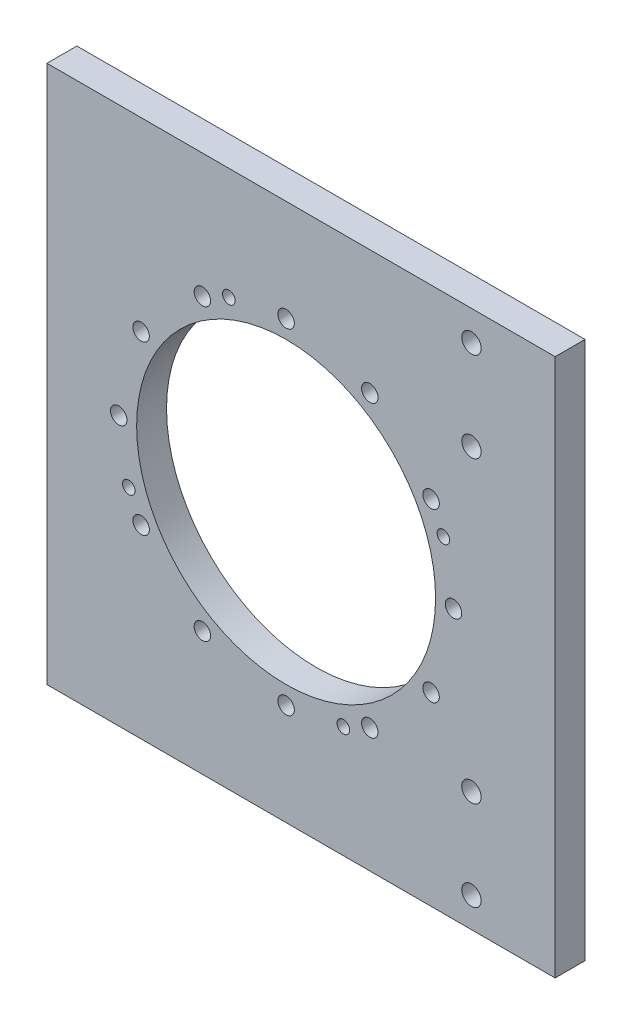
ISO-10303-21;
HEADER;
FILE_DESCRIPTION(('STEP AP214'),'2;1');
FILE_NAME('part.step','',(''),(''),'','','');
FILE_SCHEMA(('AUTOMOTIVE_DESIGN { 1 0 10303 214 1 1 1 1 }'));
ENDSEC;
DATA;
#1=APPLICATION_CONTEXT('core data for automotive mechanical design processes');
#2=APPLICATION_PROTOCOL_DEFINITION('international standard','automotive_design',2000,#1);
#3=PRODUCT_CONTEXT('',#1,'mechanical');
#4=PRODUCT('Part','Part','',(#3));
#5=PRODUCT_RELATED_PRODUCT_CATEGORY('part','',(#4));
#6=PRODUCT_DEFINITION_FORMATION('','',#4);
#7=PRODUCT_DEFINITION_CONTEXT('part definition',#1,'design');
#8=PRODUCT_DEFINITION('design','',#6,#7);
#9=PRODUCT_DEFINITION_SHAPE('','',#8);
#10=(LENGTH_UNIT() NAMED_UNIT(*) SI_UNIT(.MILLI.,.METRE.));
#11=(NAMED_UNIT(*) PLANE_ANGLE_UNIT() SI_UNIT($,.RADIAN.));
#12=(NAMED_UNIT(*) SI_UNIT($,.STERADIAN.) SOLID_ANGLE_UNIT());
#13=UNCERTAINTY_MEASURE_WITH_UNIT(LENGTH_MEASURE(1.E-05),#10,'distance_accuracy_value','');
#14=(GEOMETRIC_REPRESENTATION_CONTEXT(3) GLOBAL_UNCERTAINTY_ASSIGNED_CONTEXT((#13)) GLOBAL_UNIT_ASSIGNED_CONTEXT((#10,
#11,#12)) REPRESENTATION_CONTEXT('',''));
#15=CARTESIAN_POINT('',(0.,0.,0.));
#16=DIRECTION('',(0.,0.,1.));
#17=DIRECTION('',(1.,0.,0.));
#18=AXIS2_PLACEMENT_3D('',#15,#16,#17);
#19=CARTESIAN_POINT('',(-80.,90.,10.));
#20=DIRECTION('',(1.,0.,0.));
#21=DIRECTION('',(0.,0.,-1.));
#22=AXIS2_PLACEMENT_3D('',#19,#20,#21);
#23=PLANE('',#22);
#24=DIRECTION('',(0.,-1.,0.));
#25=VECTOR('',#24,1.);
#26=CARTESIAN_POINT('',(-80.,90.,0.));
#27=LINE('',#26,#25);
#28=CARTESIAN_POINT('',(-80.,90.,0.));
#29=VERTEX_POINT('',#28);
#30=CARTESIAN_POINT('',(-80.,-90.,0.));
#31=VERTEX_POINT('',#30);
#32=EDGE_CURVE('E115',#29,#31,#27,.T.);
#33=ORIENTED_EDGE('',*,*,#32,.T.);
#34=DIRECTION('',(0.,0.,-1.));
#35=VECTOR('',#34,1.);
#36=CARTESIAN_POINT('',(-80.,-90.,10.));
#37=LINE('',#36,#35);
#38=CARTESIAN_POINT('',(-80.,-90.,10.));
#39=VERTEX_POINT('',#38);
#40=EDGE_CURVE('E11',#39,#31,#37,.T.);
#41=ORIENTED_EDGE('',*,*,#40,.F.);
#42=DIRECTION('',(0.,-1.,0.));
#43=VECTOR('',#42,1.);
#44=CARTESIAN_POINT('',(-80.,90.,10.));
#45=LINE('',#44,#43);
#46=CARTESIAN_POINT('',(-80.,90.,10.));
#47=VERTEX_POINT('',#46);
#48=EDGE_CURVE('E99',#47,#39,#45,.T.);
#49=ORIENTED_EDGE('',*,*,#48,.F.);
#50=DIRECTION('',(0.,0.,-1.));
#51=VECTOR('',#50,1.);
#52=CARTESIAN_POINT('',(-80.,90.,10.));
#53=LINE('',#52,#51);
#54=EDGE_CURVE('E111',#47,#29,#53,.T.);
#55=ORIENTED_EDGE('',*,*,#54,.T.);
#56=EDGE_LOOP('',(#33,#41,#49,#55));
#57=FACE_BOUND('',#56,.T.);
#58=ADVANCED_FACE('F47',(#57),#23,.F.);
#59=CARTESIAN_POINT('',(-80.,-90.,10.));
#60=DIRECTION('',(0.,1.,0.));
#61=DIRECTION('',(0.,0.,1.));
#62=AXIS2_PLACEMENT_3D('',#59,#60,#61);
#63=PLANE('',#62);
#64=DIRECTION('',(1.,0.,0.));
#65=VECTOR('',#64,1.);
#66=CARTESIAN_POINT('',(-80.,-90.,0.));
#67=LINE('',#66,#65);
#68=CARTESIAN_POINT('',(90.,-90.,0.));
#69=VERTEX_POINT('',#68);
#70=EDGE_CURVE('E104',#31,#69,#67,.T.);
#71=ORIENTED_EDGE('',*,*,#70,.T.);
#72=DIRECTION('',(0.,0.,-1.));
#73=VECTOR('',#72,1.);
#74=CARTESIAN_POINT('',(90.,-90.,10.));
#75=LINE('',#74,#73);
#76=CARTESIAN_POINT('',(90.,-90.,10.));
#77=VERTEX_POINT('',#76);
#78=EDGE_CURVE('E56',#77,#69,#75,.T.);
#79=ORIENTED_EDGE('',*,*,#78,.F.);
#80=DIRECTION('',(1.,0.,0.));
#81=VECTOR('',#80,1.);
#82=CARTESIAN_POINT('',(-80.,-90.,10.));
#83=LINE('',#82,#81);
#84=EDGE_CURVE('E94',#39,#77,#83,.T.);
#85=ORIENTED_EDGE('',*,*,#84,.F.);
#86=ORIENTED_EDGE('',*,*,#40,.T.);
#87=EDGE_LOOP('',(#71,#79,#85,#86));
#88=FACE_BOUND('',#87,.T.);
#89=ADVANCED_FACE('F103',(#88),#63,.F.);
#90=CARTESIAN_POINT('',(90.,-90.,10.));
#91=DIRECTION('',(-1.,0.,0.));
#92=DIRECTION('',(0.,0.,1.));
#93=AXIS2_PLACEMENT_3D('',#90,#91,#92);
#94=PLANE('',#93);
#95=DIRECTION('',(0.,1.,0.));
#96=VECTOR('',#95,1.);
#97=CARTESIAN_POINT('',(90.,-90.,0.));
#98=LINE('',#97,#96);
#99=CARTESIAN_POINT('',(90.,90.,0.));
#100=VERTEX_POINT('',#99);
#101=EDGE_CURVE('E81',#69,#100,#98,.T.);
#102=ORIENTED_EDGE('',*,*,#101,.T.);
#103=DIRECTION('',(0.,0.,-1.));
#104=VECTOR('',#103,1.);
#105=CARTESIAN_POINT('',(90.,90.,10.));
#106=LINE('',#105,#104);
#107=CARTESIAN_POINT('',(90.,90.,10.));
#108=VERTEX_POINT('',#107);
#109=EDGE_CURVE('E106',#108,#100,#106,.T.);
#110=ORIENTED_EDGE('',*,*,#109,.F.);
#111=DIRECTION('',(0.,1.,0.));
#112=VECTOR('',#111,1.);
#113=CARTESIAN_POINT('',(90.,-90.,10.));
#114=LINE('',#113,#112);
#115=EDGE_CURVE('E97',#77,#108,#114,.T.);
#116=ORIENTED_EDGE('',*,*,#115,.F.);
#117=ORIENTED_EDGE('',*,*,#78,.T.);
#118=EDGE_LOOP('',(#102,#110,#116,#117));
#119=FACE_BOUND('',#118,.T.);
#120=ADVANCED_FACE('F107',(#119),#94,.F.);
#121=CARTESIAN_POINT('',(90.,90.,10.));
#122=DIRECTION('',(0.,-1.,0.));
#123=DIRECTION('',(0.,0.,-1.));
#124=AXIS2_PLACEMENT_3D('',#121,#122,#123);
#125=PLANE('',#124);
#126=DIRECTION('',(-1.,0.,0.));
#127=VECTOR('',#126,1.);
#128=CARTESIAN_POINT('',(90.,90.,0.));
#129=LINE('',#128,#127);
#130=EDGE_CURVE('E87',#100,#29,#129,.T.);
#131=ORIENTED_EDGE('',*,*,#130,.T.);
#132=ORIENTED_EDGE('',*,*,#54,.F.);
#133=DIRECTION('',(-1.,0.,0.));
#134=VECTOR('',#133,1.);
#135=CARTESIAN_POINT('',(90.,90.,10.));
#136=LINE('',#135,#134);
#137=EDGE_CURVE('E64',#108,#47,#136,.T.);
#138=ORIENTED_EDGE('',*,*,#137,.F.);
#139=ORIENTED_EDGE('',*,*,#109,.T.);
#140=EDGE_LOOP('',(#131,#132,#138,#139));
#141=FACE_BOUND('',#140,.T.);
#142=ADVANCED_FACE('F129',(#141),#125,.F.);
#143=CARTESIAN_POINT('',(0.,0.,10.));
#144=DIRECTION('',(0.,0.,1.));
#145=DIRECTION('',(1.,0.,0.));
#146=AXIS2_PLACEMENT_3D('',#143,#144,#145);
#147=PLANE('',#146);
#148=CARTESIAN_POINT('',(-28.,-48.4974226119286,10.));
#149=DIRECTION('',(0.,0.,1.));
#150=DIRECTION('',(1.,0.,0.));
#151=AXIS2_PLACEMENT_3D('',#148,#149,#150);
#152=CIRCLE('',#151,2.75);
#153=CARTESIAN_POINT('',(-25.25,-48.4974226119286,10.));
#154=VERTEX_POINT('',#153);
#155=EDGE_CURVE('E119',#154,#154,#152,.T.);
#156=ORIENTED_EDGE('',*,*,#155,.F.);
#157=EDGE_LOOP('',(#156));
#158=FACE_BOUND('',#157,.T.);
#159=CARTESIAN_POINT('',(0.,-56.,10.));
#160=DIRECTION('',(0.,0.,1.));
#161=DIRECTION('',(1.,0.,0.));
#162=AXIS2_PLACEMENT_3D('',#159,#160,#161);
#163=CIRCLE('',#162,2.75);
#164=CARTESIAN_POINT('',(2.74999999999999,-56.,10.));
#165=VERTEX_POINT('',#164);
#166=EDGE_CURVE('E139',#165,#165,#163,.T.);
#167=ORIENTED_EDGE('',*,*,#166,.F.);
#168=EDGE_LOOP('',(#167));
#169=FACE_BOUND('',#168,.T.);
#170=CARTESIAN_POINT('',(28.,-48.4974226119286,10.));
#171=DIRECTION('',(0.,0.,1.));
#172=DIRECTION('',(1.,0.,0.));
#173=AXIS2_PLACEMENT_3D('',#170,#171,#172);
#174=CIRCLE('',#173,2.75);
#175=CARTESIAN_POINT('',(30.75,-48.4974226119286,10.));
#176=VERTEX_POINT('',#175);
#177=EDGE_CURVE('E143',#176,#176,#174,.T.);
#178=ORIENTED_EDGE('',*,*,#177,.F.);
#179=EDGE_LOOP('',(#178));
#180=FACE_BOUND('',#179,.T.);
#181=CARTESIAN_POINT('',(48.4974226119285,-28.,10.));
#182=DIRECTION('',(0.,0.,1.));
#183=DIRECTION('',(1.,0.,0.));
#184=AXIS2_PLACEMENT_3D('',#181,#182,#183);
#185=CIRCLE('',#184,2.75);
#186=CARTESIAN_POINT('',(51.2474226119285,-28.,10.));
#187=VERTEX_POINT('',#186);
#188=EDGE_CURVE('E147',#187,#187,#185,.T.);
#189=ORIENTED_EDGE('',*,*,#188,.F.);
#190=EDGE_LOOP('',(#189));
#191=FACE_BOUND('',#190,.T.);
#192=CARTESIAN_POINT('',(52.6227867640109,19.1531280262374,10.));
#193=DIRECTION('',(0.,0.,1.));
#194=DIRECTION('',(1.,0.,0.));
#195=AXIS2_PLACEMENT_3D('',#192,#193,#194);
#196=CIRCLE('',#195,2.1);
#197=CARTESIAN_POINT('',(54.7227867640109,19.1531280262374,10.));
#198=VERTEX_POINT('',#197);
#199=EDGE_CURVE('E151',#198,#198,#196,.T.);
#200=ORIENTED_EDGE('',*,*,#199,.F.);
#201=EDGE_LOOP('',(#200));
#202=FACE_BOUND('',#201,.T.);
#203=CARTESIAN_POINT('',(-19.1531280262374,52.6227867640109,10.));
#204=DIRECTION('',(0.,0.,1.));
#205=DIRECTION('',(1.,0.,0.));
#206=AXIS2_PLACEMENT_3D('',#203,#204,#205);
#207=CIRCLE('',#206,2.1);
#208=CARTESIAN_POINT('',(-17.0531280262374,52.6227867640109,10.));
#209=VERTEX_POINT('',#208);
#210=EDGE_CURVE('E155',#209,#209,#207,.T.);
#211=ORIENTED_EDGE('',*,*,#210,.F.);
#212=EDGE_LOOP('',(#211));
#213=FACE_BOUND('',#212,.T.);
#214=CARTESIAN_POINT('',(-52.6227867640109,-19.1531280262374,10.));
#215=DIRECTION('',(0.,0.,1.));
#216=DIRECTION('',(1.,0.,0.));
#217=AXIS2_PLACEMENT_3D('',#214,#215,#216);
#218=CIRCLE('',#217,2.1);
#219=CARTESIAN_POINT('',(-50.5227867640109,-19.1531280262374,10.));
#220=VERTEX_POINT('',#219);
#221=EDGE_CURVE('E159',#220,#220,#218,.T.);
#222=ORIENTED_EDGE('',*,*,#221,.F.);
#223=EDGE_LOOP('',(#222));
#224=FACE_BOUND('',#223,.T.);
#225=CARTESIAN_POINT('',(19.1531280262375,-52.6227867640109,10.));
#226=DIRECTION('',(0.,0.,1.));
#227=DIRECTION('',(1.,0.,0.));
#228=AXIS2_PLACEMENT_3D('',#225,#226,#227);
#229=CIRCLE('',#228,2.1);
#230=CARTESIAN_POINT('',(21.2531280262375,-52.6227867640109,10.));
#231=VERTEX_POINT('',#230);
#232=EDGE_CURVE('E163',#231,#231,#229,.T.);
#233=ORIENTED_EDGE('',*,*,#232,.F.);
#234=EDGE_LOOP('',(#233));
#235=FACE_BOUND('',#234,.T.);
#236=CARTESIAN_POINT('',(-48.4974226119286,-28.,10.));
#237=DIRECTION('',(0.,0.,1.));
#238=DIRECTION('',(1.,0.,0.));
#239=AXIS2_PLACEMENT_3D('',#236,#237,#238);
#240=CIRCLE('',#239,2.75);
#241=CARTESIAN_POINT('',(-45.7474226119286,-28.,10.));
#242=VERTEX_POINT('',#241);
#243=EDGE_CURVE('E167',#242,#242,#240,.T.);
#244=ORIENTED_EDGE('',*,*,#243,.F.);
#245=EDGE_LOOP('',(#244));
#246=FACE_BOUND('',#245,.T.);
#247=CARTESIAN_POINT('',(-56.,0.,10.));
#248=DIRECTION('',(0.,0.,1.));
#249=DIRECTION('',(1.,0.,0.));
#250=AXIS2_PLACEMENT_3D('',#247,#248,#249);
#251=CIRCLE('',#250,2.75);
#252=CARTESIAN_POINT('',(-53.25,0.,10.));
#253=VERTEX_POINT('',#252);
#254=EDGE_CURVE('E171',#253,#253,#251,.T.);
#255=ORIENTED_EDGE('',*,*,#254,.F.);
#256=EDGE_LOOP('',(#255));
#257=FACE_BOUND('',#256,.T.);
#258=CARTESIAN_POINT('',(-48.4974226119286,28.,10.));
#259=DIRECTION('',(0.,0.,1.));
#260=DIRECTION('',(1.,0.,0.));
#261=AXIS2_PLACEMENT_3D('',#258,#259,#260);
#262=CIRCLE('',#261,2.75);
#263=CARTESIAN_POINT('',(-45.7474226119286,28.,10.));
#264=VERTEX_POINT('',#263);
#265=EDGE_CURVE('E175',#264,#264,#262,.T.);
#266=ORIENTED_EDGE('',*,*,#265,.F.);
#267=EDGE_LOOP('',(#266));
#268=FACE_BOUND('',#267,.T.);
#269=CARTESIAN_POINT('',(-28.,48.4974226119286,10.));
#270=DIRECTION('',(0.,0.,1.));
#271=DIRECTION('',(1.,0.,0.));
#272=AXIS2_PLACEMENT_3D('',#269,#270,#271);
#273=CIRCLE('',#272,2.75);
#274=CARTESIAN_POINT('',(-25.25,48.4974226119286,10.));
#275=VERTEX_POINT('',#274);
#276=EDGE_CURVE('E179',#275,#275,#273,.T.);
#277=ORIENTED_EDGE('',*,*,#276,.F.);
#278=EDGE_LOOP('',(#277));
#279=FACE_BOUND('',#278,.T.);
#280=CARTESIAN_POINT('',(0.,56.,10.));
#281=DIRECTION('',(0.,0.,1.));
#282=DIRECTION('',(1.,0.,0.));
#283=AXIS2_PLACEMENT_3D('',#280,#281,#282);
#284=CIRCLE('',#283,2.75);
#285=CARTESIAN_POINT('',(2.75,56.,10.));
#286=VERTEX_POINT('',#285);
#287=EDGE_CURVE('E183',#286,#286,#284,.T.);
#288=ORIENTED_EDGE('',*,*,#287,.F.);
#289=EDGE_LOOP('',(#288));
#290=FACE_BOUND('',#289,.T.);
#291=CARTESIAN_POINT('',(28.,48.4974226119286,10.));
#292=DIRECTION('',(0.,0.,1.));
#293=DIRECTION('',(1.,0.,0.));
#294=AXIS2_PLACEMENT_3D('',#291,#292,#293);
#295=CIRCLE('',#294,2.75);
#296=CARTESIAN_POINT('',(30.75,48.4974226119286,10.));
#297=VERTEX_POINT('',#296);
#298=EDGE_CURVE('E187',#297,#297,#295,.T.);
#299=ORIENTED_EDGE('',*,*,#298,.F.);
#300=EDGE_LOOP('',(#299));
#301=FACE_BOUND('',#300,.T.);
#302=CARTESIAN_POINT('',(48.4974226119286,28.,10.));
#303=DIRECTION('',(0.,0.,1.));
#304=DIRECTION('',(1.,0.,0.));
#305=AXIS2_PLACEMENT_3D('',#302,#303,#304);
#306=CIRCLE('',#305,2.75);
#307=CARTESIAN_POINT('',(51.2474226119286,28.,10.));
#308=VERTEX_POINT('',#307);
#309=EDGE_CURVE('E191',#308,#308,#306,.T.);
#310=ORIENTED_EDGE('',*,*,#309,.F.);
#311=EDGE_LOOP('',(#310));
#312=FACE_BOUND('',#311,.T.);
#313=CARTESIAN_POINT('',(56.,0.,10.));
#314=DIRECTION('',(0.,0.,1.));
#315=DIRECTION('',(1.,0.,0.));
#316=AXIS2_PLACEMENT_3D('',#313,#314,#315);
#317=CIRCLE('',#316,2.75);
#318=CARTESIAN_POINT('',(58.75,0.,10.));
#319=VERTEX_POINT('',#318);
#320=EDGE_CURVE('E195',#319,#319,#317,.T.);
#321=ORIENTED_EDGE('',*,*,#320,.F.);
#322=EDGE_LOOP('',(#321));
#323=FACE_BOUND('',#322,.T.);
#324=CARTESIAN_POINT('',(62.,-80.,10.));
#325=DIRECTION('',(0.,0.,1.));
#326=DIRECTION('',(1.,0.,0.));
#327=AXIS2_PLACEMENT_3D('',#324,#325,#326);
#328=CIRCLE('',#327,3.25);
#329=CARTESIAN_POINT('',(65.25,-80.,10.));
#330=VERTEX_POINT('',#329);
#331=EDGE_CURVE('E199',#330,#330,#328,.T.);
#332=ORIENTED_EDGE('',*,*,#331,.F.);
#333=EDGE_LOOP('',(#332));
#334=FACE_BOUND('',#333,.T.);
#335=CARTESIAN_POINT('',(62.,-50.,10.));
#336=DIRECTION('',(0.,0.,1.));
#337=DIRECTION('',(1.,0.,0.));
#338=AXIS2_PLACEMENT_3D('',#335,#336,#337);
#339=CIRCLE('',#338,3.25);
#340=CARTESIAN_POINT('',(65.25,-50.,10.));
#341=VERTEX_POINT('',#340);
#342=EDGE_CURVE('E203',#341,#341,#339,.T.);
#343=ORIENTED_EDGE('',*,*,#342,.F.);
#344=EDGE_LOOP('',(#343));
#345=FACE_BOUND('',#344,.T.);
#346=CARTESIAN_POINT('',(62.,50.,10.));
#347=DIRECTION('',(0.,0.,1.));
#348=DIRECTION('',(1.,0.,0.));
#349=AXIS2_PLACEMENT_3D('',#346,#347,#348);
#350=CIRCLE('',#349,3.25);
#351=CARTESIAN_POINT('',(65.25,50.,10.));
#352=VERTEX_POINT('',#351);
#353=EDGE_CURVE('E207',#352,#352,#350,.T.);
#354=ORIENTED_EDGE('',*,*,#353,.F.);
#355=EDGE_LOOP('',(#354));
#356=FACE_BOUND('',#355,.T.);
#357=CARTESIAN_POINT('',(62.,80.,10.));
#358=DIRECTION('',(0.,0.,1.));
#359=DIRECTION('',(1.,0.,0.));
#360=AXIS2_PLACEMENT_3D('',#357,#358,#359);
#361=CIRCLE('',#360,3.25);
#362=CARTESIAN_POINT('',(65.25,80.,10.));
#363=VERTEX_POINT('',#362);
#364=EDGE_CURVE('E211',#363,#363,#361,.T.);
#365=ORIENTED_EDGE('',*,*,#364,.F.);
#366=EDGE_LOOP('',(#365));
#367=FACE_BOUND('',#366,.T.);
#368=CARTESIAN_POINT('',(0.,0.,10.));
#369=DIRECTION('',(0.,0.,1.));
#370=DIRECTION('',(1.,0.,0.));
#371=AXIS2_PLACEMENT_3D('',#368,#369,#370);
#372=CIRCLE('',#371,50.);
#373=CARTESIAN_POINT('',(50.,0.,10.));
#374=VERTEX_POINT('',#373);
#375=EDGE_CURVE('E215',#374,#374,#372,.T.);
#376=ORIENTED_EDGE('',*,*,#375,.F.);
#377=EDGE_LOOP('',(#376));
#378=FACE_BOUND('',#377,.T.);
#379=ORIENTED_EDGE('',*,*,#48,.T.);
#380=ORIENTED_EDGE('',*,*,#84,.T.);
#381=ORIENTED_EDGE('',*,*,#115,.T.);
#382=ORIENTED_EDGE('',*,*,#137,.T.);
#383=EDGE_LOOP('',(#379,#380,#381,#382));
#384=FACE_BOUND('',#383,.T.);
#385=ADVANCED_FACE('F95',(#158,#169,#180,#191,#202,#213,#224,#235,#246,#257,#268,#279,#290,#301,
#312,#323,#334,#345,#356,#367,#378,#384),#147,.T.);
#386=CARTESIAN_POINT('',(0.,0.,0.));
#387=DIRECTION('',(0.,0.,1.));
#388=DIRECTION('',(1.,0.,0.));
#389=AXIS2_PLACEMENT_3D('',#386,#387,#388);
#390=PLANE('',#389);
#391=CARTESIAN_POINT('',(-28.,-48.4974226119286,0.));
#392=DIRECTION('',(0.,0.,-1.));
#393=DIRECTION('',(-1.,0.,0.));
#394=AXIS2_PLACEMENT_3D('',#391,#392,#393);
#395=CIRCLE('',#394,2.75);
#396=CARTESIAN_POINT('',(-30.75,-48.4974226119286,0.));
#397=VERTEX_POINT('',#396);
#398=EDGE_CURVE('E229',#397,#397,#395,.T.);
#399=ORIENTED_EDGE('',*,*,#398,.F.);
#400=EDGE_LOOP('',(#399));
#401=FACE_BOUND('',#400,.T.);
#402=CARTESIAN_POINT('',(0.,-56.,0.));
#403=DIRECTION('',(0.,0.,-1.));
#404=DIRECTION('',(-1.,0.,0.));
#405=AXIS2_PLACEMENT_3D('',#402,#403,#404);
#406=CIRCLE('',#405,2.75);
#407=CARTESIAN_POINT('',(-2.75000000000001,-56.,0.));
#408=VERTEX_POINT('',#407);
#409=EDGE_CURVE('E265',#408,#408,#406,.T.);
#410=ORIENTED_EDGE('',*,*,#409,.F.);
#411=EDGE_LOOP('',(#410));
#412=FACE_BOUND('',#411,.T.);
#413=CARTESIAN_POINT('',(28.,-48.4974226119286,0.));
#414=DIRECTION('',(0.,0.,-1.));
#415=DIRECTION('',(-1.,0.,0.));
#416=AXIS2_PLACEMENT_3D('',#413,#414,#415);
#417=CIRCLE('',#416,2.75);
#418=CARTESIAN_POINT('',(25.25,-48.4974226119286,0.));
#419=VERTEX_POINT('',#418);
#420=EDGE_CURVE('E260',#419,#419,#417,.T.);
#421=ORIENTED_EDGE('',*,*,#420,.F.);
#422=EDGE_LOOP('',(#421));
#423=FACE_BOUND('',#422,.T.);
#424=CARTESIAN_POINT('',(48.4974226119285,-28.,0.));
#425=DIRECTION('',(0.,0.,-1.));
#426=DIRECTION('',(-1.,0.,0.));
#427=AXIS2_PLACEMENT_3D('',#424,#425,#426);
#428=CIRCLE('',#427,2.75);
#429=CARTESIAN_POINT('',(45.7474226119285,-28.,0.));
#430=VERTEX_POINT('',#429);
#431=EDGE_CURVE('E256',#430,#430,#428,.T.);
#432=ORIENTED_EDGE('',*,*,#431,.F.);
#433=EDGE_LOOP('',(#432));
#434=FACE_BOUND('',#433,.T.);
#435=CARTESIAN_POINT('',(52.6227867640109,19.1531280262374,0.));
#436=DIRECTION('',(0.,0.,-1.));
#437=DIRECTION('',(-1.,0.,0.));
#438=AXIS2_PLACEMENT_3D('',#435,#436,#437);
#439=CIRCLE('',#438,2.1);
#440=CARTESIAN_POINT('',(50.5227867640109,19.1531280262374,0.));
#441=VERTEX_POINT('',#440);
#442=EDGE_CURVE('E261',#441,#441,#439,.T.);
#443=ORIENTED_EDGE('',*,*,#442,.F.);
#444=EDGE_LOOP('',(#443));
#445=FACE_BOUND('',#444,.T.);
#446=CARTESIAN_POINT('',(-19.1531280262374,52.6227867640109,0.));
#447=DIRECTION('',(0.,0.,-1.));
#448=DIRECTION('',(-1.,0.,0.));
#449=AXIS2_PLACEMENT_3D('',#446,#447,#448);
#450=CIRCLE('',#449,2.1);
#451=CARTESIAN_POINT('',(-21.2531280262374,52.6227867640109,0.));
#452=VERTEX_POINT('',#451);
#453=EDGE_CURVE('E281',#452,#452,#450,.T.);
#454=ORIENTED_EDGE('',*,*,#453,.F.);
#455=EDGE_LOOP('',(#454));
#456=FACE_BOUND('',#455,.T.);
#457=CARTESIAN_POINT('',(-52.6227867640109,-19.1531280262374,0.));
#458=DIRECTION('',(0.,0.,-1.));
#459=DIRECTION('',(-1.,0.,0.));
#460=AXIS2_PLACEMENT_3D('',#457,#458,#459);
#461=CIRCLE('',#460,2.1);
#462=CARTESIAN_POINT('',(-54.7227867640109,-19.1531280262374,0.));
#463=VERTEX_POINT('',#462);
#464=EDGE_CURVE('E276',#463,#463,#461,.T.);
#465=ORIENTED_EDGE('',*,*,#464,.F.);
#466=EDGE_LOOP('',(#465));
#467=FACE_BOUND('',#466,.T.);
#468=CARTESIAN_POINT('',(19.1531280262375,-52.6227867640109,0.));
#469=DIRECTION('',(0.,0.,-1.));
#470=DIRECTION('',(-1.,0.,0.));
#471=AXIS2_PLACEMENT_3D('',#468,#469,#470);
#472=CIRCLE('',#471,2.1);
#473=CARTESIAN_POINT('',(17.0531280262375,-52.6227867640109,0.));
#474=VERTEX_POINT('',#473);
#475=EDGE_CURVE('E272',#474,#474,#472,.T.);
#476=ORIENTED_EDGE('',*,*,#475,.F.);
#477=EDGE_LOOP('',(#476));
#478=FACE_BOUND('',#477,.T.);
#479=CARTESIAN_POINT('',(-48.4974226119286,-28.,0.));
#480=DIRECTION('',(0.,0.,-1.));
#481=DIRECTION('',(-1.,0.,0.));
#482=AXIS2_PLACEMENT_3D('',#479,#480,#481);
#483=CIRCLE('',#482,2.75);
#484=CARTESIAN_POINT('',(-51.2474226119286,-28.,0.));
#485=VERTEX_POINT('',#484);
#486=EDGE_CURVE('E224',#485,#485,#483,.T.);
#487=ORIENTED_EDGE('',*,*,#486,.F.);
#488=EDGE_LOOP('',(#487));
#489=FACE_BOUND('',#488,.T.);
#490=CARTESIAN_POINT('',(-56.,0.,0.));
#491=DIRECTION('',(0.,0.,-1.));
#492=DIRECTION('',(-1.,0.,0.));
#493=AXIS2_PLACEMENT_3D('',#490,#491,#492);
#494=CIRCLE('',#493,2.75);
#495=CARTESIAN_POINT('',(-58.75,0.,0.));
#496=VERTEX_POINT('',#495);
#497=EDGE_CURVE('E228',#496,#496,#494,.T.);
#498=ORIENTED_EDGE('',*,*,#497,.F.);
#499=EDGE_LOOP('',(#498));
#500=FACE_BOUND('',#499,.T.);
#501=CARTESIAN_POINT('',(-48.4974226119286,28.,0.));
#502=DIRECTION('',(0.,0.,-1.));
#503=DIRECTION('',(-1.,0.,0.));
#504=AXIS2_PLACEMENT_3D('',#501,#502,#503);
#505=CIRCLE('',#504,2.75);
#506=CARTESIAN_POINT('',(-51.2474226119286,28.,0.));
#507=VERTEX_POINT('',#506);
#508=EDGE_CURVE('E233',#507,#507,#505,.T.);
#509=ORIENTED_EDGE('',*,*,#508,.F.);
#510=EDGE_LOOP('',(#509));
#511=FACE_BOUND('',#510,.T.);
#512=CARTESIAN_POINT('',(-28.,48.4974226119286,0.));
#513=DIRECTION('',(0.,0.,-1.));
#514=DIRECTION('',(-1.,0.,0.));
#515=AXIS2_PLACEMENT_3D('',#512,#513,#514);
#516=CIRCLE('',#515,2.75);
#517=CARTESIAN_POINT('',(-30.75,48.4974226119286,0.));
#518=VERTEX_POINT('',#517);
#519=EDGE_CURVE('E237',#518,#518,#516,.T.);
#520=ORIENTED_EDGE('',*,*,#519,.F.);
#521=EDGE_LOOP('',(#520));
#522=FACE_BOUND('',#521,.T.);
#523=CARTESIAN_POINT('',(0.,56.,0.));
#524=DIRECTION('',(0.,0.,-1.));
#525=DIRECTION('',(-1.,0.,0.));
#526=AXIS2_PLACEMENT_3D('',#523,#524,#525);
#527=CIRCLE('',#526,2.75);
#528=CARTESIAN_POINT('',(-2.75,56.,0.));
#529=VERTEX_POINT('',#528);
#530=EDGE_CURVE('E241',#529,#529,#527,.T.);
#531=ORIENTED_EDGE('',*,*,#530,.F.);
#532=EDGE_LOOP('',(#531));
#533=FACE_BOUND('',#532,.T.);
#534=CARTESIAN_POINT('',(28.,48.4974226119286,0.));
#535=DIRECTION('',(0.,0.,-1.));
#536=DIRECTION('',(-1.,0.,0.));
#537=AXIS2_PLACEMENT_3D('',#534,#535,#536);
#538=CIRCLE('',#537,2.75);
#539=CARTESIAN_POINT('',(25.25,48.4974226119286,0.));
#540=VERTEX_POINT('',#539);
#541=EDGE_CURVE('E245',#540,#540,#538,.T.);
#542=ORIENTED_EDGE('',*,*,#541,.F.);
#543=EDGE_LOOP('',(#542));
#544=FACE_BOUND('',#543,.T.);
#545=CARTESIAN_POINT('',(48.4974226119286,28.,0.));
#546=DIRECTION('',(0.,0.,-1.));
#547=DIRECTION('',(-1.,0.,0.));
#548=AXIS2_PLACEMENT_3D('',#545,#546,#547);
#549=CIRCLE('',#548,2.75);
#550=CARTESIAN_POINT('',(45.7474226119286,28.,0.));
#551=VERTEX_POINT('',#550);
#552=EDGE_CURVE('E249',#551,#551,#549,.T.);
#553=ORIENTED_EDGE('',*,*,#552,.F.);
#554=EDGE_LOOP('',(#553));
#555=FACE_BOUND('',#554,.T.);
#556=CARTESIAN_POINT('',(56.,0.,0.));
#557=DIRECTION('',(0.,0.,-1.));
#558=DIRECTION('',(-1.,0.,0.));
#559=AXIS2_PLACEMENT_3D('',#556,#557,#558);
#560=CIRCLE('',#559,2.75);
#561=CARTESIAN_POINT('',(53.25,0.,0.));
#562=VERTEX_POINT('',#561);
#563=EDGE_CURVE('E223',#562,#562,#560,.T.);
#564=ORIENTED_EDGE('',*,*,#563,.F.);
#565=EDGE_LOOP('',(#564));
#566=FACE_BOUND('',#565,.T.);
#567=CARTESIAN_POINT('',(62.,-80.,0.));
#568=DIRECTION('',(0.,0.,-1.));
#569=DIRECTION('',(-1.,0.,0.));
#570=AXIS2_PLACEMENT_3D('',#567,#568,#569);
#571=CIRCLE('',#570,3.25);
#572=CARTESIAN_POINT('',(58.75,-80.,0.));
#573=VERTEX_POINT('',#572);
#574=EDGE_CURVE('E277',#573,#573,#571,.T.);
#575=ORIENTED_EDGE('',*,*,#574,.F.);
#576=EDGE_LOOP('',(#575));
#577=FACE_BOUND('',#576,.T.);
#578=CARTESIAN_POINT('',(62.,-50.,0.));
#579=DIRECTION('',(0.,0.,-1.));
#580=DIRECTION('',(-1.,0.,0.));
#581=AXIS2_PLACEMENT_3D('',#578,#579,#580);
#582=CIRCLE('',#581,3.25);
#583=CARTESIAN_POINT('',(58.75,-50.,0.));
#584=VERTEX_POINT('',#583);
#585=EDGE_CURVE('E296',#584,#584,#582,.T.);
#586=ORIENTED_EDGE('',*,*,#585,.F.);
#587=EDGE_LOOP('',(#586));
#588=FACE_BOUND('',#587,.T.);
#589=CARTESIAN_POINT('',(62.,50.,0.));
#590=DIRECTION('',(0.,0.,-1.));
#591=DIRECTION('',(-1.,0.,0.));
#592=AXIS2_PLACEMENT_3D('',#589,#590,#591);
#593=CIRCLE('',#592,3.25);
#594=CARTESIAN_POINT('',(58.75,50.,0.));
#595=VERTEX_POINT('',#594);
#596=EDGE_CURVE('E292',#595,#595,#593,.T.);
#597=ORIENTED_EDGE('',*,*,#596,.F.);
#598=EDGE_LOOP('',(#597));
#599=FACE_BOUND('',#598,.T.);
#600=CARTESIAN_POINT('',(62.,80.,0.));
#601=DIRECTION('',(0.,0.,-1.));
#602=DIRECTION('',(-1.,0.,0.));
#603=AXIS2_PLACEMENT_3D('',#600,#601,#602);
#604=CIRCLE('',#603,3.25);
#605=CARTESIAN_POINT('',(58.75,80.,0.));
#606=VERTEX_POINT('',#605);
#607=EDGE_CURVE('E288',#606,#606,#604,.T.);
#608=ORIENTED_EDGE('',*,*,#607,.F.);
#609=EDGE_LOOP('',(#608));
#610=FACE_BOUND('',#609,.T.);
#611=CARTESIAN_POINT('',(0.,0.,0.));
#612=DIRECTION('',(0.,0.,-1.));
#613=DIRECTION('',(-1.,0.,0.));
#614=AXIS2_PLACEMENT_3D('',#611,#612,#613);
#615=CIRCLE('',#614,50.);
#616=CARTESIAN_POINT('',(-50.,0.,0.));
#617=VERTEX_POINT('',#616);
#618=EDGE_CURVE('E219',#617,#617,#615,.T.);
#619=ORIENTED_EDGE('',*,*,#618,.F.);
#620=EDGE_LOOP('',(#619));
#621=FACE_BOUND('',#620,.T.);
#622=ORIENTED_EDGE('',*,*,#32,.F.);
#623=ORIENTED_EDGE('',*,*,#130,.F.);
#624=ORIENTED_EDGE('',*,*,#101,.F.);
#625=ORIENTED_EDGE('',*,*,#70,.F.);
#626=EDGE_LOOP('',(#622,#623,#624,#625));
#627=FACE_BOUND('',#626,.T.);
#628=ADVANCED_FACE('F132',(#401,#412,#423,#434,#445,#456,#467,#478,#489,#500,#511,#522,#533,
#544,#555,#566,#577,#588,#599,#610,#621,#627),#390,.F.);
#629=CARTESIAN_POINT('',(0.,0.,11.));
#630=DIRECTION('',(0.,0.,-1.));
#631=DIRECTION('',(-1.,0.,0.));
#632=AXIS2_PLACEMENT_3D('',#629,#630,#631);
#633=CYLINDRICAL_SURFACE('',#632,50.);
#634=ORIENTED_EDGE('',*,*,#375,.T.);
#635=EDGE_LOOP('',(#634));
#636=FACE_BOUND('',#635,.T.);
#637=ORIENTED_EDGE('',*,*,#618,.T.);
#638=EDGE_LOOP('',(#637));
#639=FACE_BOUND('',#638,.T.);
#640=ADVANCED_FACE('F308',(#636,#639),#633,.F.);
#641=CARTESIAN_POINT('',(62.,80.,11.));
#642=DIRECTION('',(0.,0.,-1.));
#643=DIRECTION('',(-1.,0.,0.));
#644=AXIS2_PLACEMENT_3D('',#641,#642,#643);
#645=CYLINDRICAL_SURFACE('',#644,3.25);
#646=ORIENTED_EDGE('',*,*,#364,.T.);
#647=EDGE_LOOP('',(#646));
#648=FACE_BOUND('',#647,.T.);
#649=ORIENTED_EDGE('',*,*,#607,.T.);
#650=EDGE_LOOP('',(#649));
#651=FACE_BOUND('',#650,.T.);
#652=ADVANCED_FACE('F320',(#648,#651),#645,.F.);
#653=CARTESIAN_POINT('',(62.,50.,11.));
#654=DIRECTION('',(0.,0.,-1.));
#655=DIRECTION('',(-1.,0.,0.));
#656=AXIS2_PLACEMENT_3D('',#653,#654,#655);
#657=CYLINDRICAL_SURFACE('',#656,3.25);
#658=ORIENTED_EDGE('',*,*,#353,.T.);
#659=EDGE_LOOP('',(#658));
#660=FACE_BOUND('',#659,.T.);
#661=ORIENTED_EDGE('',*,*,#596,.T.);
#662=EDGE_LOOP('',(#661));
#663=FACE_BOUND('',#662,.T.);
#664=ADVANCED_FACE('F326',(#660,#663),#657,.F.);
#665=CARTESIAN_POINT('',(62.,-50.,11.));
#666=DIRECTION('',(0.,0.,-1.));
#667=DIRECTION('',(-1.,0.,0.));
#668=AXIS2_PLACEMENT_3D('',#665,#666,#667);
#669=CYLINDRICAL_SURFACE('',#668,3.25);
#670=ORIENTED_EDGE('',*,*,#342,.T.);
#671=EDGE_LOOP('',(#670));
#672=FACE_BOUND('',#671,.T.);
#673=ORIENTED_EDGE('',*,*,#585,.T.);
#674=EDGE_LOOP('',(#673));
#675=FACE_BOUND('',#674,.T.);
#676=ADVANCED_FACE('F390',(#672,#675),#669,.F.);
#677=CARTESIAN_POINT('',(62.,-80.,11.));
#678=DIRECTION('',(0.,0.,-1.));
#679=DIRECTION('',(-1.,0.,0.));
#680=AXIS2_PLACEMENT_3D('',#677,#678,#679);
#681=CYLINDRICAL_SURFACE('',#680,3.25);
#682=ORIENTED_EDGE('',*,*,#331,.T.);
#683=EDGE_LOOP('',(#682));
#684=FACE_BOUND('',#683,.T.);
#685=ORIENTED_EDGE('',*,*,#574,.T.);
#686=EDGE_LOOP('',(#685));
#687=FACE_BOUND('',#686,.T.);
#688=ADVANCED_FACE('F304',(#684,#687),#681,.F.);
#689=CARTESIAN_POINT('',(56.,0.,11.));
#690=DIRECTION('',(0.,0.,-1.));
#691=DIRECTION('',(-1.,0.,0.));
#692=AXIS2_PLACEMENT_3D('',#689,#690,#691);
#693=CYLINDRICAL_SURFACE('',#692,2.75);
#694=ORIENTED_EDGE('',*,*,#320,.T.);
#695=EDGE_LOOP('',(#694));
#696=FACE_BOUND('',#695,.T.);
#697=ORIENTED_EDGE('',*,*,#563,.T.);
#698=EDGE_LOOP('',(#697));
#699=FACE_BOUND('',#698,.T.);
#700=ADVANCED_FACE('F432',(#696,#699),#693,.F.);
#701=CARTESIAN_POINT('',(48.4974226119286,28.,11.));
#702=DIRECTION('',(0.,0.,-1.));
#703=DIRECTION('',(-1.,0.,0.));
#704=AXIS2_PLACEMENT_3D('',#701,#702,#703);
#705=CYLINDRICAL_SURFACE('',#704,2.75);
#706=ORIENTED_EDGE('',*,*,#309,.T.);
#707=EDGE_LOOP('',(#706));
#708=FACE_BOUND('',#707,.T.);
#709=ORIENTED_EDGE('',*,*,#552,.T.);
#710=EDGE_LOOP('',(#709));
#711=FACE_BOUND('',#710,.T.);
#712=ADVANCED_FACE('F435',(#708,#711),#705,.F.);
#713=CARTESIAN_POINT('',(28.,48.4974226119286,11.));
#714=DIRECTION('',(0.,0.,-1.));
#715=DIRECTION('',(-1.,0.,0.));
#716=AXIS2_PLACEMENT_3D('',#713,#714,#715);
#717=CYLINDRICAL_SURFACE('',#716,2.75);
#718=ORIENTED_EDGE('',*,*,#298,.T.);
#719=EDGE_LOOP('',(#718));
#720=FACE_BOUND('',#719,.T.);
#721=ORIENTED_EDGE('',*,*,#541,.T.);
#722=EDGE_LOOP('',(#721));
#723=FACE_BOUND('',#722,.T.);
#724=ADVANCED_FACE('F439',(#720,#723),#717,.F.);
#725=CARTESIAN_POINT('',(0.,56.,11.));
#726=DIRECTION('',(0.,0.,-1.));
#727=DIRECTION('',(-1.,0.,0.));
#728=AXIS2_PLACEMENT_3D('',#725,#726,#727);
#729=CYLINDRICAL_SURFACE('',#728,2.75);
#730=ORIENTED_EDGE('',*,*,#287,.T.);
#731=EDGE_LOOP('',(#730));
#732=FACE_BOUND('',#731,.T.);
#733=ORIENTED_EDGE('',*,*,#530,.T.);
#734=EDGE_LOOP('',(#733));
#735=FACE_BOUND('',#734,.T.);
#736=ADVANCED_FACE('F443',(#732,#735),#729,.F.);
#737=CARTESIAN_POINT('',(-28.,48.4974226119286,11.));
#738=DIRECTION('',(0.,0.,-1.));
#739=DIRECTION('',(-1.,0.,0.));
#740=AXIS2_PLACEMENT_3D('',#737,#738,#739);
#741=CYLINDRICAL_SURFACE('',#740,2.75);
#742=ORIENTED_EDGE('',*,*,#276,.T.);
#743=EDGE_LOOP('',(#742));
#744=FACE_BOUND('',#743,.T.);
#745=ORIENTED_EDGE('',*,*,#519,.T.);
#746=EDGE_LOOP('',(#745));
#747=FACE_BOUND('',#746,.T.);
#748=ADVANCED_FACE('F447',(#744,#747),#741,.F.);
#749=CARTESIAN_POINT('',(-48.4974226119286,28.,11.));
#750=DIRECTION('',(0.,0.,-1.));
#751=DIRECTION('',(-1.,0.,0.));
#752=AXIS2_PLACEMENT_3D('',#749,#750,#751);
#753=CYLINDRICAL_SURFACE('',#752,2.75);
#754=ORIENTED_EDGE('',*,*,#265,.T.);
#755=EDGE_LOOP('',(#754));
#756=FACE_BOUND('',#755,.T.);
#757=ORIENTED_EDGE('',*,*,#508,.T.);
#758=EDGE_LOOP('',(#757));
#759=FACE_BOUND('',#758,.T.);
#760=ADVANCED_FACE('F451',(#756,#759),#753,.F.);
#761=CARTESIAN_POINT('',(-56.,0.,11.));
#762=DIRECTION('',(0.,0.,-1.));
#763=DIRECTION('',(-1.,0.,0.));
#764=AXIS2_PLACEMENT_3D('',#761,#762,#763);
#765=CYLINDRICAL_SURFACE('',#764,2.75);
#766=ORIENTED_EDGE('',*,*,#254,.T.);
#767=EDGE_LOOP('',(#766));
#768=FACE_BOUND('',#767,.T.);
#769=ORIENTED_EDGE('',*,*,#497,.T.);
#770=EDGE_LOOP('',(#769));
#771=FACE_BOUND('',#770,.T.);
#772=ADVANCED_FACE('F455',(#768,#771),#765,.F.);
#773=CARTESIAN_POINT('',(-48.4974226119286,-28.,11.));
#774=DIRECTION('',(0.,0.,-1.));
#775=DIRECTION('',(-1.,0.,0.));
#776=AXIS2_PLACEMENT_3D('',#773,#774,#775);
#777=CYLINDRICAL_SURFACE('',#776,2.75);
#778=ORIENTED_EDGE('',*,*,#243,.T.);
#779=EDGE_LOOP('',(#778));
#780=FACE_BOUND('',#779,.T.);
#781=ORIENTED_EDGE('',*,*,#486,.T.);
#782=EDGE_LOOP('',(#781));
#783=FACE_BOUND('',#782,.T.);
#784=ADVANCED_FACE('F415',(#780,#783),#777,.F.);
#785=CARTESIAN_POINT('',(19.1531280262375,-52.6227867640109,11.));
#786=DIRECTION('',(0.,0.,-1.));
#787=DIRECTION('',(-1.,0.,0.));
#788=AXIS2_PLACEMENT_3D('',#785,#786,#787);
#789=CYLINDRICAL_SURFACE('',#788,2.1);
#790=ORIENTED_EDGE('',*,*,#232,.T.);
#791=EDGE_LOOP('',(#790));
#792=FACE_BOUND('',#791,.T.);
#793=ORIENTED_EDGE('',*,*,#475,.T.);
#794=EDGE_LOOP('',(#793));
#795=FACE_BOUND('',#794,.T.);
#796=ADVANCED_FACE('F411',(#792,#795),#789,.F.);
#797=CARTESIAN_POINT('',(-52.6227867640109,-19.1531280262374,11.));
#798=DIRECTION('',(0.,0.,-1.));
#799=DIRECTION('',(-1.,0.,0.));
#800=AXIS2_PLACEMENT_3D('',#797,#798,#799);
#801=CYLINDRICAL_SURFACE('',#800,2.1);
#802=ORIENTED_EDGE('',*,*,#221,.T.);
#803=EDGE_LOOP('',(#802));
#804=FACE_BOUND('',#803,.T.);
#805=ORIENTED_EDGE('',*,*,#464,.T.);
#806=EDGE_LOOP('',(#805));
#807=FACE_BOUND('',#806,.T.);
#808=ADVANCED_FACE('F407',(#804,#807),#801,.F.);
#809=CARTESIAN_POINT('',(-19.1531280262374,52.6227867640109,11.));
#810=DIRECTION('',(0.,0.,-1.));
#811=DIRECTION('',(-1.,0.,0.));
#812=AXIS2_PLACEMENT_3D('',#809,#810,#811);
#813=CYLINDRICAL_SURFACE('',#812,2.1);
#814=ORIENTED_EDGE('',*,*,#210,.T.);
#815=EDGE_LOOP('',(#814));
#816=FACE_BOUND('',#815,.T.);
#817=ORIENTED_EDGE('',*,*,#453,.T.);
#818=EDGE_LOOP('',(#817));
#819=FACE_BOUND('',#818,.T.);
#820=ADVANCED_FACE('F403',(#816,#819),#813,.F.);
#821=CARTESIAN_POINT('',(52.6227867640109,19.1531280262374,11.));
#822=DIRECTION('',(0.,0.,-1.));
#823=DIRECTION('',(-1.,0.,0.));
#824=AXIS2_PLACEMENT_3D('',#821,#822,#823);
#825=CYLINDRICAL_SURFACE('',#824,2.1);
#826=ORIENTED_EDGE('',*,*,#199,.T.);
#827=EDGE_LOOP('',(#826));
#828=FACE_BOUND('',#827,.T.);
#829=ORIENTED_EDGE('',*,*,#442,.T.);
#830=EDGE_LOOP('',(#829));
#831=FACE_BOUND('',#830,.T.);
#832=ADVANCED_FACE('F399',(#828,#831),#825,.F.);
#833=CARTESIAN_POINT('',(48.4974226119285,-28.,11.));
#834=DIRECTION('',(0.,0.,-1.));
#835=DIRECTION('',(-1.,0.,0.));
#836=AXIS2_PLACEMENT_3D('',#833,#834,#835);
#837=CYLINDRICAL_SURFACE('',#836,2.75);
#838=ORIENTED_EDGE('',*,*,#188,.T.);
#839=EDGE_LOOP('',(#838));
#840=FACE_BOUND('',#839,.T.);
#841=ORIENTED_EDGE('',*,*,#431,.T.);
#842=EDGE_LOOP('',(#841));
#843=FACE_BOUND('',#842,.T.);
#844=ADVANCED_FACE('F402',(#840,#843),#837,.F.);
#845=CARTESIAN_POINT('',(28.,-48.4974226119286,11.));
#846=DIRECTION('',(0.,0.,-1.));
#847=DIRECTION('',(-1.,0.,0.));
#848=AXIS2_PLACEMENT_3D('',#845,#846,#847);
#849=CYLINDRICAL_SURFACE('',#848,2.75);
#850=ORIENTED_EDGE('',*,*,#177,.T.);
#851=EDGE_LOOP('',(#850));
#852=FACE_BOUND('',#851,.T.);
#853=ORIENTED_EDGE('',*,*,#420,.T.);
#854=EDGE_LOOP('',(#853));
#855=FACE_BOUND('',#854,.T.);
#856=ADVANCED_FACE('F424',(#852,#855),#849,.F.);
#857=CARTESIAN_POINT('',(0.,-56.,11.));
#858=DIRECTION('',(0.,0.,-1.));
#859=DIRECTION('',(-1.,0.,0.));
#860=AXIS2_PLACEMENT_3D('',#857,#858,#859);
#861=CYLINDRICAL_SURFACE('',#860,2.75);
#862=ORIENTED_EDGE('',*,*,#166,.T.);
#863=EDGE_LOOP('',(#862));
#864=FACE_BOUND('',#863,.T.);
#865=ORIENTED_EDGE('',*,*,#409,.T.);
#866=EDGE_LOOP('',(#865));
#867=FACE_BOUND('',#866,.T.);
#868=ADVANCED_FACE('F420',(#864,#867),#861,.F.);
#869=CARTESIAN_POINT('',(-28.,-48.4974226119286,11.));
#870=DIRECTION('',(0.,0.,-1.));
#871=DIRECTION('',(-1.,0.,0.));
#872=AXIS2_PLACEMENT_3D('',#869,#870,#871);
#873=CYLINDRICAL_SURFACE('',#872,2.75);
#874=ORIENTED_EDGE('',*,*,#155,.T.);
#875=EDGE_LOOP('',(#874));
#876=FACE_BOUND('',#875,.T.);
#877=ORIENTED_EDGE('',*,*,#398,.T.);
#878=EDGE_LOOP('',(#877));
#879=FACE_BOUND('',#878,.T.);
#880=ADVANCED_FACE('F417',(#876,#879),#873,.F.);
#881=CLOSED_SHELL('',(#58,#89,#120,#142,#385,#628,#640,#652,#664,#676,#688,#700,#712,#724,#736,
#748,#760,#772,#784,#796,#808,#820,#832,#844,#856,#868,#880));
#882=MANIFOLD_SOLID_BREP('B2',#881);
#883=ADVANCED_BREP_SHAPE_REPRESENTATION('',(#18,#882),#14);
#884=SHAPE_DEFINITION_REPRESENTATION(#9,#883);
ENDSEC;
END-ISO-10303-21;
